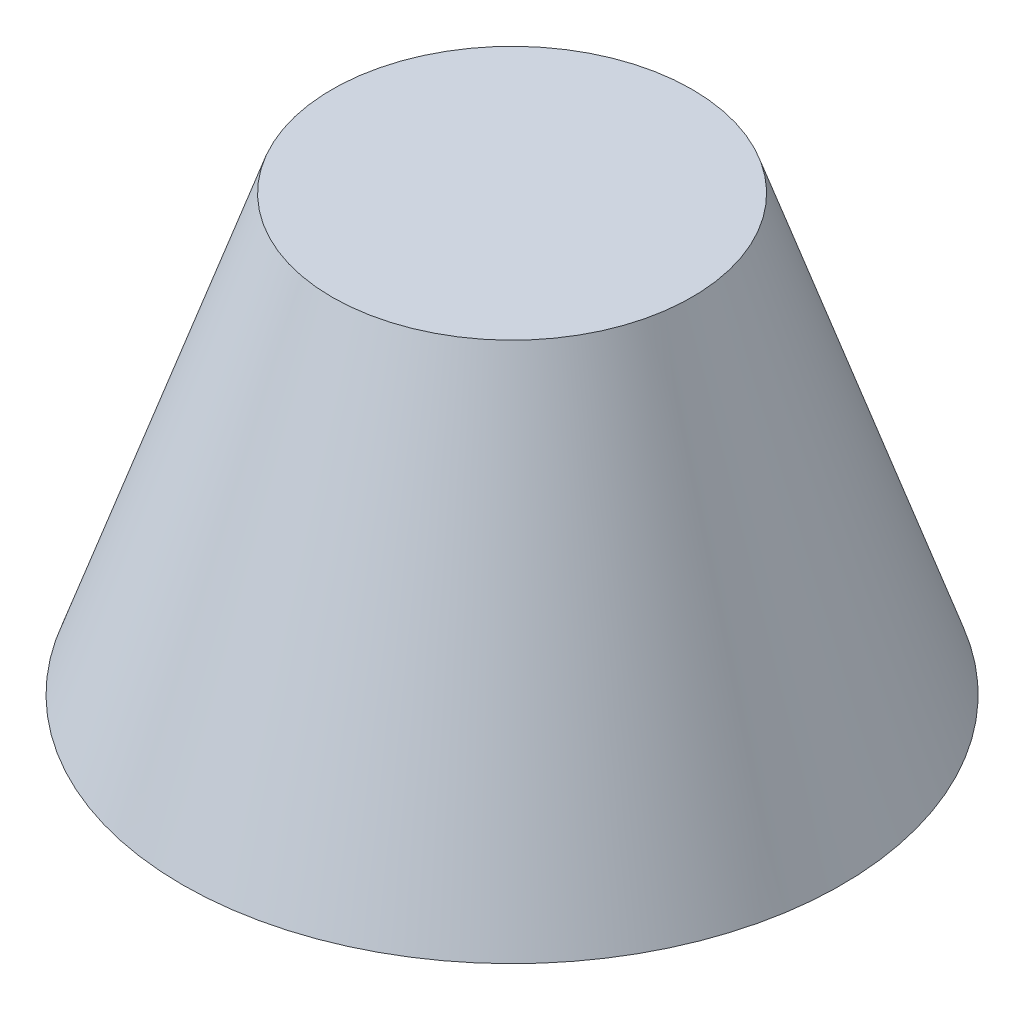
ISO-10303-21;
HEADER;
FILE_DESCRIPTION(('STEP AP214'),'2;1');
FILE_NAME('part.step','',(''),(''),'','','');
FILE_SCHEMA(('AUTOMOTIVE_DESIGN { 1 0 10303 214 1 1 1 1 }'));
ENDSEC;
DATA;
#1=APPLICATION_CONTEXT('core data for automotive mechanical design processes');
#2=APPLICATION_PROTOCOL_DEFINITION('international standard','automotive_design',2000,#1);
#3=PRODUCT_CONTEXT('',#1,'mechanical');
#4=PRODUCT('Part','Part','',(#3));
#5=PRODUCT_RELATED_PRODUCT_CATEGORY('part','',(#4));
#6=PRODUCT_DEFINITION_FORMATION('','',#4);
#7=PRODUCT_DEFINITION_CONTEXT('part definition',#1,'design');
#8=PRODUCT_DEFINITION('design','',#6,#7);
#9=PRODUCT_DEFINITION_SHAPE('','',#8);
#10=(LENGTH_UNIT() NAMED_UNIT(*) SI_UNIT(.MILLI.,.METRE.));
#11=(NAMED_UNIT(*) PLANE_ANGLE_UNIT() SI_UNIT($,.RADIAN.));
#12=(NAMED_UNIT(*) SI_UNIT($,.STERADIAN.) SOLID_ANGLE_UNIT());
#13=UNCERTAINTY_MEASURE_WITH_UNIT(LENGTH_MEASURE(1.E-05),#10,'distance_accuracy_value','');
#14=(GEOMETRIC_REPRESENTATION_CONTEXT(3) GLOBAL_UNCERTAINTY_ASSIGNED_CONTEXT((#13)) GLOBAL_UNIT_ASSIGNED_CONTEXT((#10,
#11,#12)) REPRESENTATION_CONTEXT('',''));
#15=CARTESIAN_POINT('',(0.,0.,0.));
#16=DIRECTION('',(0.,0.,1.));
#17=DIRECTION('',(1.,0.,0.));
#18=AXIS2_PLACEMENT_3D('',#15,#16,#17);
#19=CARTESIAN_POINT('',(0.,0.,0.));
#20=DIRECTION('',(0.,1.,0.));
#21=DIRECTION('',(0.,0.,1.));
#22=AXIS2_PLACEMENT_3D('',#19,#20,#21);
#23=PLANE('',#22);
#24=CARTESIAN_POINT('',(0.,0.,0.));
#25=DIRECTION('',(0.,1.,0.));
#26=DIRECTION('',(0.,0.,1.));
#27=AXIS2_PLACEMENT_3D('',#24,#25,#26);
#28=CIRCLE('',#27,68.3177201374513);
#29=CARTESIAN_POINT('',(0.,0.,68.3177201374513));
#30=VERTEX_POINT('',#29);
#31=EDGE_CURVE('E11',#30,#30,#28,.T.);
#32=ORIENTED_EDGE('',*,*,#31,.F.);
#33=EDGE_LOOP('',(#32));
#34=FACE_BOUND('',#33,.T.);
#35=ADVANCED_FACE('F35',(#34),#23,.F.);
#36=CARTESIAN_POINT('',(0.,90.,0.));
#37=DIRECTION('',(0.,1.,0.));
#38=DIRECTION('',(0.,0.,1.));
#39=AXIS2_PLACEMENT_3D('',#36,#37,#38);
#40=PLANE('',#39);
#41=CARTESIAN_POINT('',(0.,90.,0.));
#42=DIRECTION('',(0.,1.,0.));
#43=DIRECTION('',(0.,0.,1.));
#44=AXIS2_PLACEMENT_3D('',#41,#42,#43);
#45=CIRCLE('',#44,37.3125360588726);
#46=CARTESIAN_POINT('',(0.,90.,37.3125360588726));
#47=VERTEX_POINT('',#46);
#48=EDGE_CURVE('E43',#47,#47,#45,.T.);
#49=ORIENTED_EDGE('',*,*,#48,.T.);
#50=EDGE_LOOP('',(#49));
#51=FACE_BOUND('',#50,.T.);
#52=ADVANCED_FACE('F67',(#51),#40,.T.);
#53=CARTESIAN_POINT('',(0.,90.,0.));
#54=DIRECTION('',(0.,-1.,0.));
#55=DIRECTION('',(0.,0.,-1.));
#56=AXIS2_PLACEMENT_3D('',#53,#54,#55);
#57=CONICAL_SURFACE('',#56,37.3125360588726,0.331768492675463);
#58=ORIENTED_EDGE('',*,*,#48,.F.);
#59=EDGE_LOOP('',(#58));
#60=FACE_BOUND('',#59,.T.);
#61=ORIENTED_EDGE('',*,*,#31,.T.);
#62=EDGE_LOOP('',(#61));
#63=FACE_BOUND('',#62,.T.);
#64=ADVANCED_FACE('F75',(#60,#63),#57,.T.);
#65=CLOSED_SHELL('',(#35,#52,#64));
#66=MANIFOLD_SOLID_BREP('B2',#65);
#67=ADVANCED_BREP_SHAPE_REPRESENTATION('',(#18,#66),#14);
#68=SHAPE_DEFINITION_REPRESENTATION(#9,#67);
ENDSEC;
END-ISO-10303-21;
